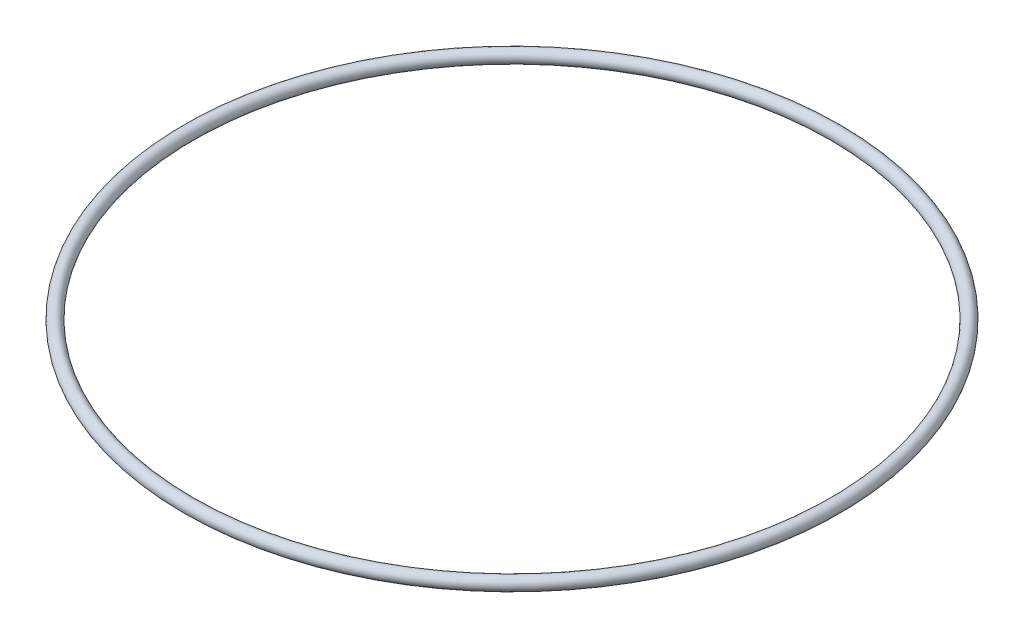
ISO-10303-21;
HEADER;
FILE_DESCRIPTION(('STEP AP214'),'2;1');
FILE_NAME('part.step','',(''),(''),'','','');
FILE_SCHEMA(('AUTOMOTIVE_DESIGN { 1 0 10303 214 1 1 1 1 }'));
ENDSEC;
DATA;
#1=APPLICATION_CONTEXT('core data for automotive mechanical design processes');
#2=APPLICATION_PROTOCOL_DEFINITION('international standard','automotive_design',2000,#1);
#3=PRODUCT_CONTEXT('',#1,'mechanical');
#4=PRODUCT('Part','Part','',(#3));
#5=PRODUCT_RELATED_PRODUCT_CATEGORY('part','',(#4));
#6=PRODUCT_DEFINITION_FORMATION('','',#4);
#7=PRODUCT_DEFINITION_CONTEXT('part definition',#1,'design');
#8=PRODUCT_DEFINITION('design','',#6,#7);
#9=PRODUCT_DEFINITION_SHAPE('','',#8);
#10=(LENGTH_UNIT() NAMED_UNIT(*) SI_UNIT(.MILLI.,.METRE.));
#11=(NAMED_UNIT(*) PLANE_ANGLE_UNIT() SI_UNIT($,.RADIAN.));
#12=(NAMED_UNIT(*) SI_UNIT($,.STERADIAN.) SOLID_ANGLE_UNIT());
#13=UNCERTAINTY_MEASURE_WITH_UNIT(LENGTH_MEASURE(1.E-05),#10,'distance_accuracy_value','');
#14=(GEOMETRIC_REPRESENTATION_CONTEXT(3) GLOBAL_UNCERTAINTY_ASSIGNED_CONTEXT((#13)) GLOBAL_UNIT_ASSIGNED_CONTEXT((#10,
#11,#12)) REPRESENTATION_CONTEXT('',''));
#15=CARTESIAN_POINT('',(0.,0.,0.));
#16=DIRECTION('',(0.,0.,1.));
#17=DIRECTION('',(1.,0.,0.));
#18=AXIS2_PLACEMENT_3D('',#15,#16,#17);
#19=CARTESIAN_POINT('',(0.,0.,0.));
#20=DIRECTION('',(0.,-1.,0.));
#21=DIRECTION('',(0.,0.,-1.));
#22=AXIS2_PLACEMENT_3D('',#19,#20,#21);
#23=TOROIDAL_SURFACE('',#22,41.91,0.825500000000003);
#24=CARTESIAN_POINT('',(0.,0.,-42.7355));
#25=VERTEX_POINT('',#24);
#26=VERTEX_LOOP('',#25);
#27=FACE_BOUND('',#26,.T.);
#28=ADVANCED_FACE('F29',(#27),#23,.T.);
#29=CLOSED_SHELL('',(#28));
#30=MANIFOLD_SOLID_BREP('B2',#29);
#31=ADVANCED_BREP_SHAPE_REPRESENTATION('',(#18,#30),#14);
#32=SHAPE_DEFINITION_REPRESENTATION(#9,#31);
ENDSEC;
END-ISO-10303-21;
